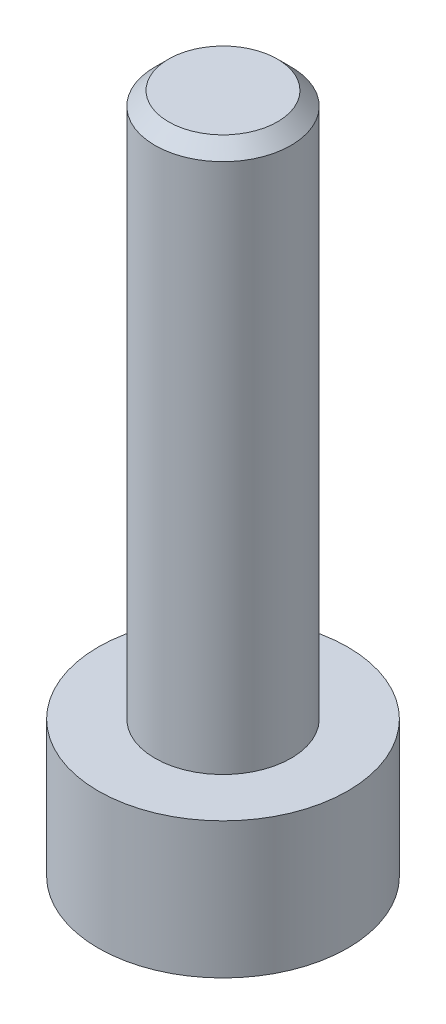
ISO-10303-21;
HEADER;
FILE_DESCRIPTION(('STEP AP214'),'2;1');
FILE_NAME('part.step','',(''),(''),'','','');
FILE_SCHEMA(('AUTOMOTIVE_DESIGN { 1 0 10303 214 1 1 1 1 }'));
ENDSEC;
DATA;
#1=APPLICATION_CONTEXT('core data for automotive mechanical design processes');
#2=APPLICATION_PROTOCOL_DEFINITION('international standard','automotive_design',2000,#1);
#3=PRODUCT_CONTEXT('',#1,'mechanical');
#4=PRODUCT('Part','Part','',(#3));
#5=PRODUCT_RELATED_PRODUCT_CATEGORY('part','',(#4));
#6=PRODUCT_DEFINITION_FORMATION('','',#4);
#7=PRODUCT_DEFINITION_CONTEXT('part definition',#1,'design');
#8=PRODUCT_DEFINITION('design','',#6,#7);
#9=PRODUCT_DEFINITION_SHAPE('','',#8);
#10=(LENGTH_UNIT() NAMED_UNIT(*) SI_UNIT(.MILLI.,.METRE.));
#11=(NAMED_UNIT(*) PLANE_ANGLE_UNIT() SI_UNIT($,.RADIAN.));
#12=(NAMED_UNIT(*) SI_UNIT($,.STERADIAN.) SOLID_ANGLE_UNIT());
#13=UNCERTAINTY_MEASURE_WITH_UNIT(LENGTH_MEASURE(1.E-05),#10,'distance_accuracy_value','');
#14=(GEOMETRIC_REPRESENTATION_CONTEXT(3) GLOBAL_UNCERTAINTY_ASSIGNED_CONTEXT((#13)) GLOBAL_UNIT_ASSIGNED_CONTEXT((#10,
#11,#12)) REPRESENTATION_CONTEXT('',''));
#15=CARTESIAN_POINT('',(0.,0.,0.));
#16=DIRECTION('',(0.,0.,1.));
#17=DIRECTION('',(1.,0.,0.));
#18=AXIS2_PLACEMENT_3D('',#15,#16,#17);
#19=CARTESIAN_POINT('',(0.,3.,0.));
#20=DIRECTION('',(0.,1.,0.));
#21=DIRECTION('',(0.,0.,1.));
#22=AXIS2_PLACEMENT_3D('',#19,#20,#21);
#23=PLANE('',#22);
#24=CARTESIAN_POINT('',(0.,3.,0.));
#25=DIRECTION('',(0.,1.,0.));
#26=DIRECTION('',(0.,0.,1.));
#27=AXIS2_PLACEMENT_3D('',#24,#25,#26);
#28=CIRCLE('',#27,2.75);
#29=CARTESIAN_POINT('',(0.,3.,2.75));
#30=VERTEX_POINT('',#29);
#31=EDGE_CURVE('E146',#30,#30,#28,.T.);
#32=ORIENTED_EDGE('',*,*,#31,.T.);
#33=EDGE_LOOP('',(#32));
#34=FACE_BOUND('',#33,.T.);
#35=CARTESIAN_POINT('',(0.,3.,0.));
#36=DIRECTION('',(0.,1.,0.));
#37=DIRECTION('',(0.,0.,1.));
#38=AXIS2_PLACEMENT_3D('',#35,#36,#37);
#39=CIRCLE('',#38,1.5);
#40=CARTESIAN_POINT('',(0.,3.,1.5));
#41=VERTEX_POINT('',#40);
#42=EDGE_CURVE('E127',#41,#41,#39,.T.);
#43=ORIENTED_EDGE('',*,*,#42,.F.);
#44=EDGE_LOOP('',(#43));
#45=FACE_BOUND('',#44,.T.);
#46=ADVANCED_FACE('F37',(#34,#45),#23,.T.);
#47=CARTESIAN_POINT('',(0.,3.,0.));
#48=DIRECTION('',(0.,-1.,0.));
#49=DIRECTION('',(0.,0.,-1.));
#50=AXIS2_PLACEMENT_3D('',#47,#48,#49);
#51=CYLINDRICAL_SURFACE('',#50,2.75);
#52=ORIENTED_EDGE('',*,*,#31,.F.);
#53=EDGE_LOOP('',(#52));
#54=FACE_BOUND('',#53,.T.);
#55=CARTESIAN_POINT('',(0.,0.,0.));
#56=DIRECTION('',(0.,1.,0.));
#57=DIRECTION('',(0.,0.,1.));
#58=AXIS2_PLACEMENT_3D('',#55,#56,#57);
#59=CIRCLE('',#58,2.75);
#60=CARTESIAN_POINT('',(0.,0.,2.75));
#61=VERTEX_POINT('',#60);
#62=EDGE_CURVE('E140',#61,#61,#59,.T.);
#63=ORIENTED_EDGE('',*,*,#62,.T.);
#64=EDGE_LOOP('',(#63));
#65=FACE_BOUND('',#64,.T.);
#66=ADVANCED_FACE('F164',(#54,#65),#51,.T.);
#67=CARTESIAN_POINT('',(0.,0.,0.));
#68=DIRECTION('',(0.,1.,0.));
#69=DIRECTION('',(0.,0.,1.));
#70=AXIS2_PLACEMENT_3D('',#67,#68,#69);
#71=PLANE('',#70);
#72=DIRECTION('',(-0.866025403784438,0.,-0.5));
#73=VECTOR('',#72,1.);
#74=CARTESIAN_POINT('',(0.,0.,1.25));
#75=LINE('',#74,#73);
#76=CARTESIAN_POINT('',(0.,0.,1.25));
#77=VERTEX_POINT('',#76);
#78=CARTESIAN_POINT('',(-1.08253175473055,0.,0.625));
#79=VERTEX_POINT('',#78);
#80=EDGE_CURVE('E126',#77,#79,#75,.T.);
#81=ORIENTED_EDGE('',*,*,#80,.F.);
#82=DIRECTION('',(-0.866025403784439,0.,0.5));
#83=VECTOR('',#82,1.);
#84=CARTESIAN_POINT('',(1.08253175473055,0.,0.625));
#85=LINE('',#84,#83);
#86=CARTESIAN_POINT('',(1.08253175473055,0.,0.625));
#87=VERTEX_POINT('',#86);
#88=EDGE_CURVE('E52',#87,#77,#85,.T.);
#89=ORIENTED_EDGE('',*,*,#88,.F.);
#90=DIRECTION('',(0.,0.,1.));
#91=VECTOR('',#90,1.);
#92=CARTESIAN_POINT('',(1.08253175473055,0.,-0.625));
#93=LINE('',#92,#91);
#94=CARTESIAN_POINT('',(1.08253175473055,0.,-0.625));
#95=VERTEX_POINT('',#94);
#96=EDGE_CURVE('E136',#95,#87,#93,.T.);
#97=ORIENTED_EDGE('',*,*,#96,.F.);
#98=DIRECTION('',(0.866025403784439,0.,0.5));
#99=VECTOR('',#98,1.);
#100=CARTESIAN_POINT('',(0.,0.,-1.25));
#101=LINE('',#100,#99);
#102=CARTESIAN_POINT('',(0.,0.,-1.25));
#103=VERTEX_POINT('',#102);
#104=EDGE_CURVE('E134',#103,#95,#101,.T.);
#105=ORIENTED_EDGE('',*,*,#104,.F.);
#106=DIRECTION('',(0.866025403784439,0.,-0.5));
#107=VECTOR('',#106,1.);
#108=CARTESIAN_POINT('',(-1.08253175473055,0.,-0.625));
#109=LINE('',#108,#107);
#110=CARTESIAN_POINT('',(-1.08253175473055,0.,-0.625));
#111=VERTEX_POINT('',#110);
#112=EDGE_CURVE('E100',#111,#103,#109,.T.);
#113=ORIENTED_EDGE('',*,*,#112,.F.);
#114=DIRECTION('',(0.,0.,-1.));
#115=VECTOR('',#114,1.);
#116=CARTESIAN_POINT('',(-1.08253175473055,0.,0.625));
#117=LINE('',#116,#115);
#118=EDGE_CURVE('E130',#79,#111,#117,.T.);
#119=ORIENTED_EDGE('',*,*,#118,.F.);
#120=EDGE_LOOP('',(#81,#89,#97,#105,#113,#119));
#121=FACE_BOUND('',#120,.T.);
#122=ORIENTED_EDGE('',*,*,#62,.F.);
#123=EDGE_LOOP('',(#122));
#124=FACE_BOUND('',#123,.T.);
#125=ADVANCED_FACE('F170',(#121,#124),#71,.F.);
#126=CARTESIAN_POINT('',(1.08253175473055,1.5,0.625));
#127=DIRECTION('',(0.5,0.,0.866025403784439));
#128=DIRECTION('',(0.866025403784439,0.,-0.5));
#129=AXIS2_PLACEMENT_3D('',#126,#127,#128);
#130=PLANE('',#129);
#131=ORIENTED_EDGE('',*,*,#88,.T.);
#132=DIRECTION('',(0.,-1.,0.));
#133=VECTOR('',#132,1.);
#134=CARTESIAN_POINT('',(0.,1.5,1.25));
#135=LINE('',#134,#133);
#136=CARTESIAN_POINT('',(0.,1.5,1.25));
#137=VERTEX_POINT('',#136);
#138=EDGE_CURVE('E82',#137,#77,#135,.T.);
#139=ORIENTED_EDGE('',*,*,#138,.F.);
#140=DIRECTION('',(-0.866025403784439,0.,0.5));
#141=VECTOR('',#140,1.);
#142=CARTESIAN_POINT('',(1.08253175473055,1.5,0.625));
#143=LINE('',#142,#141);
#144=CARTESIAN_POINT('',(1.08253175473055,1.5,0.625));
#145=VERTEX_POINT('',#144);
#146=EDGE_CURVE('E138',#145,#137,#143,.T.);
#147=ORIENTED_EDGE('',*,*,#146,.F.);
#148=DIRECTION('',(0.,-1.,0.));
#149=VECTOR('',#148,1.);
#150=CARTESIAN_POINT('',(1.08253175473055,1.5,0.625));
#151=LINE('',#150,#149);
#152=EDGE_CURVE('E60',#145,#87,#151,.T.);
#153=ORIENTED_EDGE('',*,*,#152,.T.);
#154=EDGE_LOOP('',(#131,#139,#147,#153));
#155=FACE_BOUND('',#154,.T.);
#156=ADVANCED_FACE('F175',(#155),#130,.F.);
#157=CARTESIAN_POINT('',(1.08253175473055,1.5,-0.625));
#158=DIRECTION('',(1.,0.,0.));
#159=DIRECTION('',(0.,0.,-1.));
#160=AXIS2_PLACEMENT_3D('',#157,#158,#159);
#161=PLANE('',#160);
#162=ORIENTED_EDGE('',*,*,#96,.T.);
#163=ORIENTED_EDGE('',*,*,#152,.F.);
#164=DIRECTION('',(0.,0.,1.));
#165=VECTOR('',#164,1.);
#166=CARTESIAN_POINT('',(1.08253175473055,1.5,-0.625));
#167=LINE('',#166,#165);
#168=CARTESIAN_POINT('',(1.08253175473055,1.5,-0.625));
#169=VERTEX_POINT('',#168);
#170=EDGE_CURVE('E112',#169,#145,#167,.T.);
#171=ORIENTED_EDGE('',*,*,#170,.F.);
#172=DIRECTION('',(0.,-1.,0.));
#173=VECTOR('',#172,1.);
#174=CARTESIAN_POINT('',(1.08253175473055,1.5,-0.625));
#175=LINE('',#174,#173);
#176=EDGE_CURVE('E104',#169,#95,#175,.T.);
#177=ORIENTED_EDGE('',*,*,#176,.T.);
#178=EDGE_LOOP('',(#162,#163,#171,#177));
#179=FACE_BOUND('',#178,.T.);
#180=ADVANCED_FACE('F182',(#179),#161,.F.);
#181=CARTESIAN_POINT('',(0.,1.5,-1.25));
#182=DIRECTION('',(0.5,0.,-0.866025403784438));
#183=DIRECTION('',(-0.866025403784439,0.,-0.5));
#184=AXIS2_PLACEMENT_3D('',#181,#182,#183);
#185=PLANE('',#184);
#186=ORIENTED_EDGE('',*,*,#104,.T.);
#187=ORIENTED_EDGE('',*,*,#176,.F.);
#188=DIRECTION('',(0.866025403784439,0.,0.5));
#189=VECTOR('',#188,1.);
#190=CARTESIAN_POINT('',(0.,1.5,-1.25));
#191=LINE('',#190,#189);
#192=CARTESIAN_POINT('',(0.,1.5,-1.25));
#193=VERTEX_POINT('',#192);
#194=EDGE_CURVE('E108',#193,#169,#191,.T.);
#195=ORIENTED_EDGE('',*,*,#194,.F.);
#196=DIRECTION('',(0.,-1.,0.));
#197=VECTOR('',#196,1.);
#198=CARTESIAN_POINT('',(0.,1.5,-1.25));
#199=LINE('',#198,#197);
#200=EDGE_CURVE('E93',#193,#103,#199,.T.);
#201=ORIENTED_EDGE('',*,*,#200,.T.);
#202=EDGE_LOOP('',(#186,#187,#195,#201));
#203=FACE_BOUND('',#202,.T.);
#204=ADVANCED_FACE('F109',(#203),#185,.F.);
#205=CARTESIAN_POINT('',(-1.08253175473055,1.5,-0.625));
#206=DIRECTION('',(-0.5,0.,-0.866025403784438));
#207=DIRECTION('',(-0.866025403784439,0.,0.5));
#208=AXIS2_PLACEMENT_3D('',#205,#206,#207);
#209=PLANE('',#208);
#210=ORIENTED_EDGE('',*,*,#112,.T.);
#211=ORIENTED_EDGE('',*,*,#200,.F.);
#212=DIRECTION('',(0.866025403784439,0.,-0.5));
#213=VECTOR('',#212,1.);
#214=CARTESIAN_POINT('',(-1.08253175473055,1.5,-0.625));
#215=LINE('',#214,#213);
#216=CARTESIAN_POINT('',(-1.08253175473055,1.5,-0.625));
#217=VERTEX_POINT('',#216);
#218=EDGE_CURVE('E97',#217,#193,#215,.T.);
#219=ORIENTED_EDGE('',*,*,#218,.F.);
#220=DIRECTION('',(0.,-1.,0.));
#221=VECTOR('',#220,1.);
#222=CARTESIAN_POINT('',(-1.08253175473055,1.5,-0.625));
#223=LINE('',#222,#221);
#224=EDGE_CURVE('E105',#217,#111,#223,.T.);
#225=ORIENTED_EDGE('',*,*,#224,.T.);
#226=EDGE_LOOP('',(#210,#211,#219,#225));
#227=FACE_BOUND('',#226,.T.);
#228=ADVANCED_FACE('F95',(#227),#209,.F.);
#229=CARTESIAN_POINT('',(-1.08253175473055,1.5,0.625));
#230=DIRECTION('',(-1.,0.,0.));
#231=DIRECTION('',(0.,0.,1.));
#232=AXIS2_PLACEMENT_3D('',#229,#230,#231);
#233=PLANE('',#232);
#234=ORIENTED_EDGE('',*,*,#118,.T.);
#235=ORIENTED_EDGE('',*,*,#224,.F.);
#236=DIRECTION('',(0.,0.,-1.));
#237=VECTOR('',#236,1.);
#238=CARTESIAN_POINT('',(-1.08253175473055,1.5,0.625));
#239=LINE('',#238,#237);
#240=CARTESIAN_POINT('',(-1.08253175473055,1.5,0.625));
#241=VERTEX_POINT('',#240);
#242=EDGE_CURVE('E118',#241,#217,#239,.T.);
#243=ORIENTED_EDGE('',*,*,#242,.F.);
#244=DIRECTION('',(0.,-1.,0.));
#245=VECTOR('',#244,1.);
#246=CARTESIAN_POINT('',(-1.08253175473055,1.5,0.625));
#247=LINE('',#246,#245);
#248=EDGE_CURVE('E143',#241,#79,#247,.T.);
#249=ORIENTED_EDGE('',*,*,#248,.T.);
#250=EDGE_LOOP('',(#234,#235,#243,#249));
#251=FACE_BOUND('',#250,.T.);
#252=ADVANCED_FACE('F210',(#251),#233,.F.);
#253=CARTESIAN_POINT('',(0.,1.5,1.25));
#254=DIRECTION('',(-0.5,0.,0.866025403784439));
#255=DIRECTION('',(0.866025403784439,0.,0.5));
#256=AXIS2_PLACEMENT_3D('',#253,#254,#255);
#257=PLANE('',#256);
#258=ORIENTED_EDGE('',*,*,#80,.T.);
#259=ORIENTED_EDGE('',*,*,#248,.F.);
#260=DIRECTION('',(-0.866025403784438,0.,-0.5));
#261=VECTOR('',#260,1.);
#262=CARTESIAN_POINT('',(0.,1.5,1.25));
#263=LINE('',#262,#261);
#264=EDGE_CURVE('E120',#137,#241,#263,.T.);
#265=ORIENTED_EDGE('',*,*,#264,.F.);
#266=ORIENTED_EDGE('',*,*,#138,.T.);
#267=EDGE_LOOP('',(#258,#259,#265,#266));
#268=FACE_BOUND('',#267,.T.);
#269=ADVANCED_FACE('F190',(#268),#257,.F.);
#270=CARTESIAN_POINT('',(0.,1.5,0.));
#271=DIRECTION('',(0.,-1.,0.));
#272=DIRECTION('',(0.,0.,-1.));
#273=AXIS2_PLACEMENT_3D('',#270,#271,#272);
#274=PLANE('',#273);
#275=ORIENTED_EDGE('',*,*,#146,.T.);
#276=ORIENTED_EDGE('',*,*,#264,.T.);
#277=ORIENTED_EDGE('',*,*,#242,.T.);
#278=ORIENTED_EDGE('',*,*,#218,.T.);
#279=ORIENTED_EDGE('',*,*,#194,.T.);
#280=ORIENTED_EDGE('',*,*,#170,.T.);
#281=EDGE_LOOP('',(#275,#276,#277,#278,#279,#280));
#282=FACE_BOUND('',#281,.T.);
#283=ADVANCED_FACE('F115',(#282),#274,.T.);
#284=CARTESIAN_POINT('',(0.,15.,0.));
#285=DIRECTION('',(0.,-1.,0.));
#286=DIRECTION('',(0.,0.,-1.));
#287=AXIS2_PLACEMENT_3D('',#284,#285,#286);
#288=CYLINDRICAL_SURFACE('',#287,1.5);
#289=CARTESIAN_POINT('',(0.,14.7,0.));
#290=DIRECTION('',(0.,1.,0.));
#291=DIRECTION('',(0.,0.,1.));
#292=AXIS2_PLACEMENT_3D('',#289,#290,#291);
#293=CIRCLE('',#292,1.5);
#294=CARTESIAN_POINT('',(0.,14.7,1.5));
#295=VERTEX_POINT('',#294);
#296=EDGE_CURVE('E11',#295,#295,#293,.F.);
#297=ORIENTED_EDGE('',*,*,#296,.T.);
#298=EDGE_LOOP('',(#297));
#299=FACE_BOUND('',#298,.T.);
#300=ORIENTED_EDGE('',*,*,#42,.T.);
#301=EDGE_LOOP('',(#300));
#302=FACE_BOUND('',#301,.T.);
#303=ADVANCED_FACE('F160',(#299,#302),#288,.T.);
#304=CARTESIAN_POINT('',(0.,15.,0.));
#305=DIRECTION('',(0.,1.,0.));
#306=DIRECTION('',(0.,0.,1.));
#307=AXIS2_PLACEMENT_3D('',#304,#305,#306);
#308=PLANE('',#307);
#309=CARTESIAN_POINT('',(0.,15.,0.));
#310=DIRECTION('',(0.,1.,0.));
#311=DIRECTION('',(0.,0.,1.));
#312=AXIS2_PLACEMENT_3D('',#309,#310,#311);
#313=CIRCLE('',#312,1.2);
#314=CARTESIAN_POINT('',(0.,15.,1.2));
#315=VERTEX_POINT('',#314);
#316=EDGE_CURVE('E45',#315,#315,#313,.T.);
#317=ORIENTED_EDGE('',*,*,#316,.T.);
#318=EDGE_LOOP('',(#317));
#319=FACE_BOUND('',#318,.T.);
#320=ADVANCED_FACE('F153',(#319),#308,.T.);
#321=CARTESIAN_POINT('',(0.,15.,0.));
#322=DIRECTION('',(0.,-1.,0.));
#323=DIRECTION('',(0.,0.,-1.));
#324=AXIS2_PLACEMENT_3D('',#321,#322,#323);
#325=CONICAL_SURFACE('',#324,1.2,0.785398163397447);
#326=ORIENTED_EDGE('',*,*,#296,.F.);
#327=EDGE_LOOP('',(#326));
#328=FACE_BOUND('',#327,.T.);
#329=ORIENTED_EDGE('',*,*,#316,.F.);
#330=EDGE_LOOP('',(#329));
#331=FACE_BOUND('',#330,.T.);
#332=ADVANCED_FACE('F39',(#328,#331),#325,.T.);
#333=CLOSED_SHELL('',(#46,#66,#125,#156,#180,#204,#228,#252,#269,#283,#303,#320,#332));
#334=MANIFOLD_SOLID_BREP('B2',#333);
#335=ADVANCED_BREP_SHAPE_REPRESENTATION('',(#18,#334),#14);
#336=SHAPE_DEFINITION_REPRESENTATION(#9,#335);
ENDSEC;
END-ISO-10303-21;
